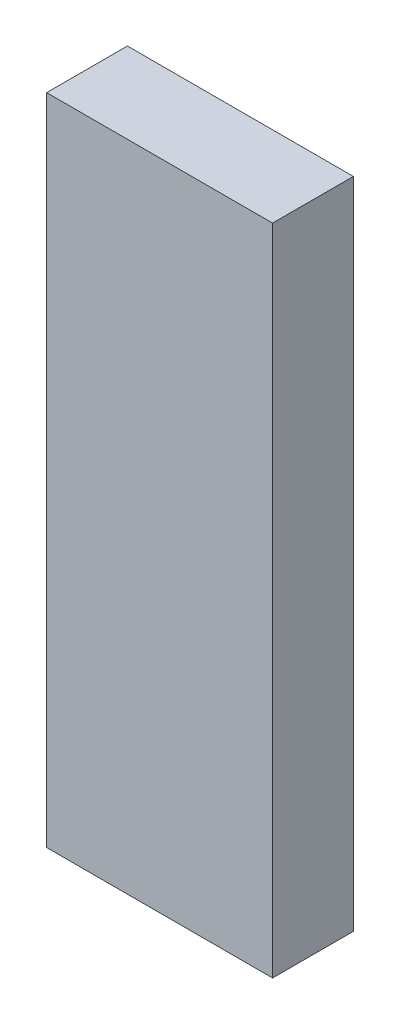
ISO-10303-21;
HEADER;
FILE_DESCRIPTION(('STEP AP214'),'2;1');
FILE_NAME('part.step','',(''),(''),'','','');
FILE_SCHEMA(('AUTOMOTIVE_DESIGN { 1 0 10303 214 1 1 1 1 }'));
ENDSEC;
DATA;
#1=APPLICATION_CONTEXT('core data for automotive mechanical design processes');
#2=APPLICATION_PROTOCOL_DEFINITION('international standard','automotive_design',2000,#1);
#3=PRODUCT_CONTEXT('',#1,'mechanical');
#4=PRODUCT('Part','Part','',(#3));
#5=PRODUCT_RELATED_PRODUCT_CATEGORY('part','',(#4));
#6=PRODUCT_DEFINITION_FORMATION('','',#4);
#7=PRODUCT_DEFINITION_CONTEXT('part definition',#1,'design');
#8=PRODUCT_DEFINITION('design','',#6,#7);
#9=PRODUCT_DEFINITION_SHAPE('','',#8);
#10=(LENGTH_UNIT() NAMED_UNIT(*) SI_UNIT(.MILLI.,.METRE.));
#11=(NAMED_UNIT(*) PLANE_ANGLE_UNIT() SI_UNIT($,.RADIAN.));
#12=(NAMED_UNIT(*) SI_UNIT($,.STERADIAN.) SOLID_ANGLE_UNIT());
#13=UNCERTAINTY_MEASURE_WITH_UNIT(LENGTH_MEASURE(1.E-05),#10,'distance_accuracy_value','');
#14=(GEOMETRIC_REPRESENTATION_CONTEXT(3) GLOBAL_UNCERTAINTY_ASSIGNED_CONTEXT((#13)) GLOBAL_UNIT_ASSIGNED_CONTEXT((#10,
#11,#12)) REPRESENTATION_CONTEXT('',''));
#15=CARTESIAN_POINT('',(0.,0.,0.));
#16=DIRECTION('',(0.,0.,1.));
#17=DIRECTION('',(1.,0.,0.));
#18=AXIS2_PLACEMENT_3D('',#15,#16,#17);
#19=CARTESIAN_POINT('',(447.5,1295.,320.));
#20=DIRECTION('',(-1.,0.,0.));
#21=DIRECTION('',(0.,-1.,0.));
#22=AXIS2_PLACEMENT_3D('',#19,#20,#21);
#23=PLANE('',#22);
#24=DIRECTION('',(0.,1.,0.));
#25=VECTOR('',#24,1.);
#26=CARTESIAN_POINT('',(447.5,1295.,0.));
#27=LINE('',#26,#25);
#28=CARTESIAN_POINT('',(447.5,-1295.,0.));
#29=VERTEX_POINT('',#28);
#30=CARTESIAN_POINT('',(447.5,1295.,0.));
#31=VERTEX_POINT('',#30);
#32=EDGE_CURVE('E98',#29,#31,#27,.T.);
#33=ORIENTED_EDGE('',*,*,#32,.T.);
#34=DIRECTION('',(0.,0.,-1.));
#35=VECTOR('',#34,1.);
#36=CARTESIAN_POINT('',(447.5,1295.,320.));
#37=LINE('',#36,#35);
#38=CARTESIAN_POINT('',(447.5,1295.,320.));
#39=VERTEX_POINT('',#38);
#40=EDGE_CURVE('E11',#39,#31,#37,.T.);
#41=ORIENTED_EDGE('',*,*,#40,.F.);
#42=DIRECTION('',(0.,1.,0.));
#43=VECTOR('',#42,1.);
#44=CARTESIAN_POINT('',(447.5,1295.,320.));
#45=LINE('',#44,#43);
#46=CARTESIAN_POINT('',(447.5,-1295.,320.));
#47=VERTEX_POINT('',#46);
#48=EDGE_CURVE('E86',#47,#39,#45,.T.);
#49=ORIENTED_EDGE('',*,*,#48,.F.);
#50=DIRECTION('',(0.,0.,-1.));
#51=VECTOR('',#50,1.);
#52=CARTESIAN_POINT('',(447.5,-1295.,320.));
#53=LINE('',#52,#51);
#54=EDGE_CURVE('E94',#47,#29,#53,.T.);
#55=ORIENTED_EDGE('',*,*,#54,.T.);
#56=EDGE_LOOP('',(#33,#41,#49,#55));
#57=FACE_BOUND('',#56,.T.);
#58=ADVANCED_FACE('F35',(#57),#23,.F.);
#59=CARTESIAN_POINT('',(-447.5,1295.,320.));
#60=DIRECTION('',(0.,-1.,0.));
#61=DIRECTION('',(0.,0.,-1.));
#62=AXIS2_PLACEMENT_3D('',#59,#60,#61);
#63=PLANE('',#62);
#64=DIRECTION('',(-1.,0.,0.));
#65=VECTOR('',#64,1.);
#66=CARTESIAN_POINT('',(-447.5,1295.,0.));
#67=LINE('',#66,#65);
#68=CARTESIAN_POINT('',(-447.5,1295.,0.));
#69=VERTEX_POINT('',#68);
#70=EDGE_CURVE('E90',#31,#69,#67,.T.);
#71=ORIENTED_EDGE('',*,*,#70,.T.);
#72=DIRECTION('',(0.,0.,-1.));
#73=VECTOR('',#72,1.);
#74=CARTESIAN_POINT('',(-447.5,1295.,320.));
#75=LINE('',#74,#73);
#76=CARTESIAN_POINT('',(-447.5,1295.,320.));
#77=VERTEX_POINT('',#76);
#78=EDGE_CURVE('E43',#77,#69,#75,.T.);
#79=ORIENTED_EDGE('',*,*,#78,.F.);
#80=DIRECTION('',(-1.,0.,0.));
#81=VECTOR('',#80,1.);
#82=CARTESIAN_POINT('',(-447.5,1295.,320.));
#83=LINE('',#82,#81);
#84=EDGE_CURVE('E81',#39,#77,#83,.T.);
#85=ORIENTED_EDGE('',*,*,#84,.F.);
#86=ORIENTED_EDGE('',*,*,#40,.T.);
#87=EDGE_LOOP('',(#71,#79,#85,#86));
#88=FACE_BOUND('',#87,.T.);
#89=ADVANCED_FACE('F89',(#88),#63,.F.);
#90=CARTESIAN_POINT('',(-447.5,1295.,320.));
#91=DIRECTION('',(1.,0.,0.));
#92=DIRECTION('',(0.,1.,0.));
#93=AXIS2_PLACEMENT_3D('',#90,#91,#92);
#94=PLANE('',#93);
#95=DIRECTION('',(0.,-1.,0.));
#96=VECTOR('',#95,1.);
#97=CARTESIAN_POINT('',(-447.5,1295.,0.));
#98=LINE('',#97,#96);
#99=CARTESIAN_POINT('',(-447.5,-1295.,0.));
#100=VERTEX_POINT('',#99);
#101=EDGE_CURVE('E68',#69,#100,#98,.T.);
#102=ORIENTED_EDGE('',*,*,#101,.T.);
#103=DIRECTION('',(0.,0.,-1.));
#104=VECTOR('',#103,1.);
#105=CARTESIAN_POINT('',(-447.5,-1295.,320.));
#106=LINE('',#105,#104);
#107=CARTESIAN_POINT('',(-447.5,-1295.,320.));
#108=VERTEX_POINT('',#107);
#109=EDGE_CURVE('E91',#108,#100,#106,.T.);
#110=ORIENTED_EDGE('',*,*,#109,.F.);
#111=DIRECTION('',(0.,-1.,0.));
#112=VECTOR('',#111,1.);
#113=CARTESIAN_POINT('',(-447.5,1295.,320.));
#114=LINE('',#113,#112);
#115=EDGE_CURVE('E84',#77,#108,#114,.T.);
#116=ORIENTED_EDGE('',*,*,#115,.F.);
#117=ORIENTED_EDGE('',*,*,#78,.T.);
#118=EDGE_LOOP('',(#102,#110,#116,#117));
#119=FACE_BOUND('',#118,.T.);
#120=ADVANCED_FACE('F92',(#119),#94,.F.);
#121=CARTESIAN_POINT('',(-447.5,-1295.,320.));
#122=DIRECTION('',(0.,1.,0.));
#123=DIRECTION('',(0.,0.,1.));
#124=AXIS2_PLACEMENT_3D('',#121,#122,#123);
#125=PLANE('',#124);
#126=DIRECTION('',(1.,0.,0.));
#127=VECTOR('',#126,1.);
#128=CARTESIAN_POINT('',(-447.5,-1295.,0.));
#129=LINE('',#128,#127);
#130=EDGE_CURVE('E74',#100,#29,#129,.T.);
#131=ORIENTED_EDGE('',*,*,#130,.T.);
#132=ORIENTED_EDGE('',*,*,#54,.F.);
#133=DIRECTION('',(1.,0.,0.));
#134=VECTOR('',#133,1.);
#135=CARTESIAN_POINT('',(-447.5,-1295.,320.));
#136=LINE('',#135,#134);
#137=EDGE_CURVE('E51',#108,#47,#136,.T.);
#138=ORIENTED_EDGE('',*,*,#137,.F.);
#139=ORIENTED_EDGE('',*,*,#109,.T.);
#140=EDGE_LOOP('',(#131,#132,#138,#139));
#141=FACE_BOUND('',#140,.T.);
#142=ADVANCED_FACE('F105',(#141),#125,.F.);
#143=CARTESIAN_POINT('',(0.,0.,320.));
#144=DIRECTION('',(0.,0.,1.));
#145=DIRECTION('',(1.,0.,0.));
#146=AXIS2_PLACEMENT_3D('',#143,#144,#145);
#147=PLANE('',#146);
#148=ORIENTED_EDGE('',*,*,#48,.T.);
#149=ORIENTED_EDGE('',*,*,#84,.T.);
#150=ORIENTED_EDGE('',*,*,#115,.T.);
#151=ORIENTED_EDGE('',*,*,#137,.T.);
#152=EDGE_LOOP('',(#148,#149,#150,#151));
#153=FACE_BOUND('',#152,.T.);
#154=ADVANCED_FACE('F82',(#153),#147,.T.);
#155=CARTESIAN_POINT('',(0.,0.,0.));
#156=DIRECTION('',(0.,0.,1.));
#157=DIRECTION('',(1.,0.,0.));
#158=AXIS2_PLACEMENT_3D('',#155,#156,#157);
#159=PLANE('',#158);
#160=ORIENTED_EDGE('',*,*,#32,.F.);
#161=ORIENTED_EDGE('',*,*,#130,.F.);
#162=ORIENTED_EDGE('',*,*,#101,.F.);
#163=ORIENTED_EDGE('',*,*,#70,.F.);
#164=EDGE_LOOP('',(#160,#161,#162,#163));
#165=FACE_BOUND('',#164,.T.);
#166=ADVANCED_FACE('F108',(#165),#159,.F.);
#167=CLOSED_SHELL('',(#58,#89,#120,#142,#154,#166));
#168=MANIFOLD_SOLID_BREP('B2',#167);
#169=ADVANCED_BREP_SHAPE_REPRESENTATION('',(#18,#168),#14);
#170=SHAPE_DEFINITION_REPRESENTATION(#9,#169);
ENDSEC;
END-ISO-10303-21;
